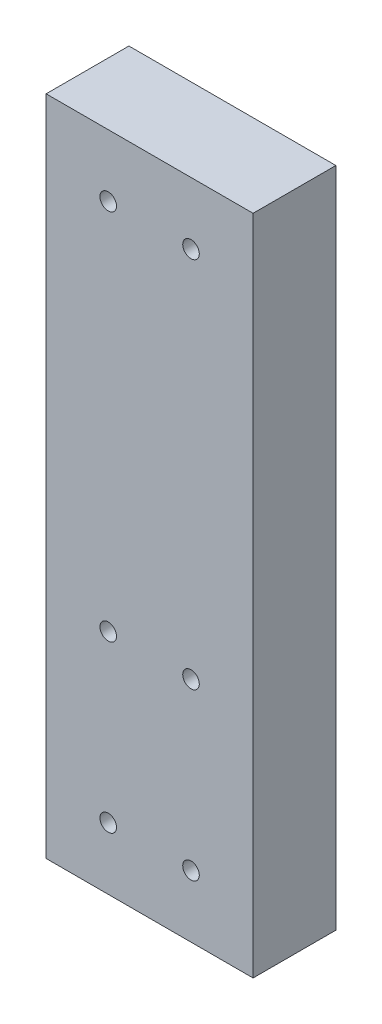
ISO-10303-21;
HEADER;
FILE_DESCRIPTION(('STEP AP214'),'2;1');
FILE_NAME('part.step','',(''),(''),'','','');
FILE_SCHEMA(('AUTOMOTIVE_DESIGN { 1 0 10303 214 1 1 1 1 }'));
ENDSEC;
DATA;
#1=APPLICATION_CONTEXT('core data for automotive mechanical design processes');
#2=APPLICATION_PROTOCOL_DEFINITION('international standard','automotive_design',2000,#1);
#3=PRODUCT_CONTEXT('',#1,'mechanical');
#4=PRODUCT('Part','Part','',(#3));
#5=PRODUCT_RELATED_PRODUCT_CATEGORY('part','',(#4));
#6=PRODUCT_DEFINITION_FORMATION('','',#4);
#7=PRODUCT_DEFINITION_CONTEXT('part definition',#1,'design');
#8=PRODUCT_DEFINITION('design','',#6,#7);
#9=PRODUCT_DEFINITION_SHAPE('','',#8);
#10=(LENGTH_UNIT() NAMED_UNIT(*) SI_UNIT(.MILLI.,.METRE.));
#11=(NAMED_UNIT(*) PLANE_ANGLE_UNIT() SI_UNIT($,.RADIAN.));
#12=(NAMED_UNIT(*) SI_UNIT($,.STERADIAN.) SOLID_ANGLE_UNIT());
#13=UNCERTAINTY_MEASURE_WITH_UNIT(LENGTH_MEASURE(1.E-05),#10,'distance_accuracy_value','');
#14=(GEOMETRIC_REPRESENTATION_CONTEXT(3) GLOBAL_UNCERTAINTY_ASSIGNED_CONTEXT((#13)) GLOBAL_UNIT_ASSIGNED_CONTEXT((#10,
#11,#12)) REPRESENTATION_CONTEXT('',''));
#15=CARTESIAN_POINT('',(0.,0.,0.));
#16=DIRECTION('',(0.,0.,1.));
#17=DIRECTION('',(1.,0.,0.));
#18=AXIS2_PLACEMENT_3D('',#15,#16,#17);
#19=CARTESIAN_POINT('',(0.,0.,10.));
#20=DIRECTION('',(0.,0.,1.));
#21=DIRECTION('',(1.,0.,0.));
#22=AXIS2_PLACEMENT_3D('',#19,#20,#21);
#23=PLANE('',#22);
#24=CARTESIAN_POINT('',(7.50000000000001,-72.5,10.));
#25=DIRECTION('',(0.,0.,1.));
#26=DIRECTION('',(1.,0.,0.));
#27=AXIS2_PLACEMENT_3D('',#24,#25,#26);
#28=CIRCLE('',#27,1.);
#29=CARTESIAN_POINT('',(8.50000000000001,-72.5,10.));
#30=VERTEX_POINT('',#29);
#31=EDGE_CURVE('E120',#30,#30,#28,.T.);
#32=ORIENTED_EDGE('',*,*,#31,.F.);
#33=EDGE_LOOP('',(#32));
#34=FACE_BOUND('',#33,.T.);
#35=CARTESIAN_POINT('',(7.5,-7.5,10.));
#36=DIRECTION('',(0.,0.,1.));
#37=DIRECTION('',(1.,0.,0.));
#38=AXIS2_PLACEMENT_3D('',#35,#36,#37);
#39=CIRCLE('',#38,1.);
#40=CARTESIAN_POINT('',(8.5,-7.5,10.));
#41=VERTEX_POINT('',#40);
#42=EDGE_CURVE('E139',#41,#41,#39,.T.);
#43=ORIENTED_EDGE('',*,*,#42,.F.);
#44=EDGE_LOOP('',(#43));
#45=FACE_BOUND('',#44,.T.);
#46=CARTESIAN_POINT('',(17.5,-52.5,10.));
#47=DIRECTION('',(0.,0.,-1.));
#48=DIRECTION('',(-1.,0.,0.));
#49=AXIS2_PLACEMENT_3D('',#46,#47,#48);
#50=CIRCLE('',#49,1.);
#51=CARTESIAN_POINT('',(16.5,-52.5,10.));
#52=VERTEX_POINT('',#51);
#53=EDGE_CURVE('E126',#52,#52,#50,.T.);
#54=ORIENTED_EDGE('',*,*,#53,.T.);
#55=EDGE_LOOP('',(#54));
#56=FACE_BOUND('',#55,.T.);
#57=DIRECTION('',(0.,-1.,0.));
#58=VECTOR('',#57,1.);
#59=CARTESIAN_POINT('',(0.,0.,10.));
#60=LINE('',#59,#58);
#61=CARTESIAN_POINT('',(0.,0.,10.));
#62=VERTEX_POINT('',#61);
#63=CARTESIAN_POINT('',(0.,-80.,10.));
#64=VERTEX_POINT('',#63);
#65=EDGE_CURVE('E90',#62,#64,#60,.T.);
#66=ORIENTED_EDGE('',*,*,#65,.T.);
#67=DIRECTION('',(1.,0.,0.));
#68=VECTOR('',#67,1.);
#69=CARTESIAN_POINT('',(0.,-80.,10.));
#70=LINE('',#69,#68);
#71=CARTESIAN_POINT('',(25.,-80.,10.));
#72=VERTEX_POINT('',#71);
#73=EDGE_CURVE('E85',#64,#72,#70,.T.);
#74=ORIENTED_EDGE('',*,*,#73,.T.);
#75=DIRECTION('',(0.,1.,0.));
#76=VECTOR('',#75,1.);
#77=CARTESIAN_POINT('',(25.,0.,10.));
#78=LINE('',#77,#76);
#79=CARTESIAN_POINT('',(25.,0.,10.));
#80=VERTEX_POINT('',#79);
#81=EDGE_CURVE('E88',#72,#80,#78,.T.);
#82=ORIENTED_EDGE('',*,*,#81,.T.);
#83=DIRECTION('',(-1.,0.,0.));
#84=VECTOR('',#83,1.);
#85=CARTESIAN_POINT('',(0.,0.,10.));
#86=LINE('',#85,#84);
#87=EDGE_CURVE('E55',#80,#62,#86,.T.);
#88=ORIENTED_EDGE('',*,*,#87,.T.);
#89=EDGE_LOOP('',(#66,#74,#82,#88));
#90=FACE_BOUND('',#89,.T.);
#91=CARTESIAN_POINT('',(7.50000000000001,-52.5,10.));
#92=DIRECTION('',(0.,0.,1.));
#93=DIRECTION('',(1.,0.,0.));
#94=AXIS2_PLACEMENT_3D('',#91,#92,#93);
#95=CIRCLE('',#94,1.);
#96=CARTESIAN_POINT('',(8.50000000000001,-52.5,10.));
#97=VERTEX_POINT('',#96);
#98=EDGE_CURVE('E117',#97,#97,#95,.T.);
#99=ORIENTED_EDGE('',*,*,#98,.F.);
#100=EDGE_LOOP('',(#99));
#101=FACE_BOUND('',#100,.T.);
#102=CARTESIAN_POINT('',(17.5,-72.5,10.));
#103=DIRECTION('',(0.,0.,-1.));
#104=DIRECTION('',(-1.,0.,0.));
#105=AXIS2_PLACEMENT_3D('',#102,#103,#104);
#106=CIRCLE('',#105,1.);
#107=CARTESIAN_POINT('',(16.5,-72.5,10.));
#108=VERTEX_POINT('',#107);
#109=EDGE_CURVE('E127',#108,#108,#106,.T.);
#110=ORIENTED_EDGE('',*,*,#109,.T.);
#111=EDGE_LOOP('',(#110));
#112=FACE_BOUND('',#111,.T.);
#113=CARTESIAN_POINT('',(17.5,-7.5,10.));
#114=DIRECTION('',(0.,0.,-1.));
#115=DIRECTION('',(-1.,0.,0.));
#116=AXIS2_PLACEMENT_3D('',#113,#114,#115);
#117=CIRCLE('',#116,0.999999999999998);
#118=CARTESIAN_POINT('',(16.5,-7.5,10.));
#119=VERTEX_POINT('',#118);
#120=EDGE_CURVE('E133',#119,#119,#117,.T.);
#121=ORIENTED_EDGE('',*,*,#120,.T.);
#122=EDGE_LOOP('',(#121));
#123=FACE_BOUND('',#122,.T.);
#124=ADVANCED_FACE('F38',(#34,#45,#56,#90,#101,#112,#123),#23,.T.);
#125=CARTESIAN_POINT('',(0.,0.,0.));
#126=DIRECTION('',(0.,0.,1.));
#127=DIRECTION('',(1.,0.,0.));
#128=AXIS2_PLACEMENT_3D('',#125,#126,#127);
#129=PLANE('',#128);
#130=CARTESIAN_POINT('',(7.50000000000001,-72.5,0.));
#131=DIRECTION('',(0.,0.,1.));
#132=DIRECTION('',(1.,0.,0.));
#133=AXIS2_PLACEMENT_3D('',#130,#131,#132);
#134=CIRCLE('',#133,1.);
#135=CARTESIAN_POINT('',(8.50000000000001,-72.5,0.));
#136=VERTEX_POINT('',#135);
#137=EDGE_CURVE('E142',#136,#136,#134,.T.);
#138=ORIENTED_EDGE('',*,*,#137,.T.);
#139=EDGE_LOOP('',(#138));
#140=FACE_BOUND('',#139,.T.);
#141=CARTESIAN_POINT('',(7.5,-7.5,0.));
#142=DIRECTION('',(0.,0.,1.));
#143=DIRECTION('',(1.,0.,0.));
#144=AXIS2_PLACEMENT_3D('',#141,#142,#143);
#145=CIRCLE('',#144,1.);
#146=CARTESIAN_POINT('',(8.5,-7.5,0.));
#147=VERTEX_POINT('',#146);
#148=EDGE_CURVE('E136',#147,#147,#145,.T.);
#149=ORIENTED_EDGE('',*,*,#148,.T.);
#150=EDGE_LOOP('',(#149));
#151=FACE_BOUND('',#150,.T.);
#152=CARTESIAN_POINT('',(7.50000000000001,-52.5,0.));
#153=DIRECTION('',(0.,0.,1.));
#154=DIRECTION('',(1.,0.,0.));
#155=AXIS2_PLACEMENT_3D('',#152,#153,#154);
#156=CIRCLE('',#155,1.);
#157=CARTESIAN_POINT('',(8.50000000000001,-52.5,0.));
#158=VERTEX_POINT('',#157);
#159=EDGE_CURVE('E105',#158,#158,#156,.T.);
#160=ORIENTED_EDGE('',*,*,#159,.T.);
#161=EDGE_LOOP('',(#160));
#162=FACE_BOUND('',#161,.T.);
#163=DIRECTION('',(0.,-1.,0.));
#164=VECTOR('',#163,1.);
#165=CARTESIAN_POINT('',(0.,0.,0.));
#166=LINE('',#165,#164);
#167=CARTESIAN_POINT('',(0.,0.,0.));
#168=VERTEX_POINT('',#167);
#169=CARTESIAN_POINT('',(0.,-80.,0.));
#170=VERTEX_POINT('',#169);
#171=EDGE_CURVE('E102',#168,#170,#166,.T.);
#172=ORIENTED_EDGE('',*,*,#171,.F.);
#173=DIRECTION('',(-1.,0.,0.));
#174=VECTOR('',#173,1.);
#175=CARTESIAN_POINT('',(0.,0.,0.));
#176=LINE('',#175,#174);
#177=CARTESIAN_POINT('',(25.,0.,0.));
#178=VERTEX_POINT('',#177);
#179=EDGE_CURVE('E78',#178,#168,#176,.T.);
#180=ORIENTED_EDGE('',*,*,#179,.F.);
#181=DIRECTION('',(0.,1.,0.));
#182=VECTOR('',#181,1.);
#183=CARTESIAN_POINT('',(25.,0.,0.));
#184=LINE('',#183,#182);
#185=CARTESIAN_POINT('',(25.,-80.,0.));
#186=VERTEX_POINT('',#185);
#187=EDGE_CURVE('E72',#186,#178,#184,.T.);
#188=ORIENTED_EDGE('',*,*,#187,.F.);
#189=DIRECTION('',(1.,0.,0.));
#190=VECTOR('',#189,1.);
#191=CARTESIAN_POINT('',(0.,-80.,0.));
#192=LINE('',#191,#190);
#193=EDGE_CURVE('E94',#170,#186,#192,.T.);
#194=ORIENTED_EDGE('',*,*,#193,.F.);
#195=EDGE_LOOP('',(#172,#180,#188,#194));
#196=FACE_BOUND('',#195,.T.);
#197=CARTESIAN_POINT('',(17.5,-72.5,0.));
#198=DIRECTION('',(0.,0.,-1.));
#199=DIRECTION('',(-1.,0.,0.));
#200=AXIS2_PLACEMENT_3D('',#197,#198,#199);
#201=CIRCLE('',#200,1.);
#202=CARTESIAN_POINT('',(16.5,-72.5,0.));
#203=VERTEX_POINT('',#202);
#204=EDGE_CURVE('E147',#203,#203,#201,.T.);
#205=ORIENTED_EDGE('',*,*,#204,.F.);
#206=EDGE_LOOP('',(#205));
#207=FACE_BOUND('',#206,.T.);
#208=CARTESIAN_POINT('',(17.5,-52.5,0.));
#209=DIRECTION('',(0.,0.,-1.));
#210=DIRECTION('',(-1.,0.,0.));
#211=AXIS2_PLACEMENT_3D('',#208,#209,#210);
#212=CIRCLE('',#211,1.);
#213=CARTESIAN_POINT('',(16.5,-52.5,0.));
#214=VERTEX_POINT('',#213);
#215=EDGE_CURVE('E123',#214,#214,#212,.T.);
#216=ORIENTED_EDGE('',*,*,#215,.F.);
#217=EDGE_LOOP('',(#216));
#218=FACE_BOUND('',#217,.T.);
#219=CARTESIAN_POINT('',(17.5,-7.5,0.));
#220=DIRECTION('',(0.,0.,-1.));
#221=DIRECTION('',(-1.,0.,0.));
#222=AXIS2_PLACEMENT_3D('',#219,#220,#221);
#223=CIRCLE('',#222,0.999999999999998);
#224=CARTESIAN_POINT('',(16.5,-7.5,0.));
#225=VERTEX_POINT('',#224);
#226=EDGE_CURVE('E130',#225,#225,#223,.T.);
#227=ORIENTED_EDGE('',*,*,#226,.F.);
#228=EDGE_LOOP('',(#227));
#229=FACE_BOUND('',#228,.T.);
#230=ADVANCED_FACE('F113',(#140,#151,#162,#196,#207,#218,#229),#129,.F.);
#231=CARTESIAN_POINT('',(0.,0.,10.));
#232=DIRECTION('',(1.,0.,0.));
#233=DIRECTION('',(0.,1.,0.));
#234=AXIS2_PLACEMENT_3D('',#231,#232,#233);
#235=PLANE('',#234);
#236=ORIENTED_EDGE('',*,*,#171,.T.);
#237=DIRECTION('',(0.,0.,-1.));
#238=VECTOR('',#237,1.);
#239=CARTESIAN_POINT('',(0.,-80.,10.));
#240=LINE('',#239,#238);
#241=EDGE_CURVE('E11',#64,#170,#240,.T.);
#242=ORIENTED_EDGE('',*,*,#241,.F.);
#243=ORIENTED_EDGE('',*,*,#65,.F.);
#244=DIRECTION('',(0.,0.,-1.));
#245=VECTOR('',#244,1.);
#246=CARTESIAN_POINT('',(0.,0.,10.));
#247=LINE('',#246,#245);
#248=EDGE_CURVE('E98',#62,#168,#247,.T.);
#249=ORIENTED_EDGE('',*,*,#248,.T.);
#250=EDGE_LOOP('',(#236,#242,#243,#249));
#251=FACE_BOUND('',#250,.T.);
#252=ADVANCED_FACE('F40',(#251),#235,.F.);
#253=CARTESIAN_POINT('',(0.,-80.,10.));
#254=DIRECTION('',(0.,1.,0.));
#255=DIRECTION('',(0.,0.,1.));
#256=AXIS2_PLACEMENT_3D('',#253,#254,#255);
#257=PLANE('',#256);
#258=ORIENTED_EDGE('',*,*,#193,.T.);
#259=DIRECTION('',(0.,0.,-1.));
#260=VECTOR('',#259,1.);
#261=CARTESIAN_POINT('',(25.,-80.,10.));
#262=LINE('',#261,#260);
#263=EDGE_CURVE('E47',#72,#186,#262,.T.);
#264=ORIENTED_EDGE('',*,*,#263,.F.);
#265=ORIENTED_EDGE('',*,*,#73,.F.);
#266=ORIENTED_EDGE('',*,*,#241,.T.);
#267=EDGE_LOOP('',(#258,#264,#265,#266));
#268=FACE_BOUND('',#267,.T.);
#269=ADVANCED_FACE('F93',(#268),#257,.F.);
#270=CARTESIAN_POINT('',(25.,0.,10.));
#271=DIRECTION('',(-1.,0.,0.));
#272=DIRECTION('',(0.,-1.,0.));
#273=AXIS2_PLACEMENT_3D('',#270,#271,#272);
#274=PLANE('',#273);
#275=ORIENTED_EDGE('',*,*,#187,.T.);
#276=DIRECTION('',(0.,0.,-1.));
#277=VECTOR('',#276,1.);
#278=CARTESIAN_POINT('',(25.,0.,10.));
#279=LINE('',#278,#277);
#280=EDGE_CURVE('E95',#80,#178,#279,.T.);
#281=ORIENTED_EDGE('',*,*,#280,.F.);
#282=ORIENTED_EDGE('',*,*,#81,.F.);
#283=ORIENTED_EDGE('',*,*,#263,.T.);
#284=EDGE_LOOP('',(#275,#281,#282,#283));
#285=FACE_BOUND('',#284,.T.);
#286=ADVANCED_FACE('F96',(#285),#274,.F.);
#287=CARTESIAN_POINT('',(0.,0.,10.));
#288=DIRECTION('',(0.,-1.,0.));
#289=DIRECTION('',(0.,0.,-1.));
#290=AXIS2_PLACEMENT_3D('',#287,#288,#289);
#291=PLANE('',#290);
#292=ORIENTED_EDGE('',*,*,#179,.T.);
#293=ORIENTED_EDGE('',*,*,#248,.F.);
#294=ORIENTED_EDGE('',*,*,#87,.F.);
#295=ORIENTED_EDGE('',*,*,#280,.T.);
#296=EDGE_LOOP('',(#292,#293,#294,#295));
#297=FACE_BOUND('',#296,.T.);
#298=ADVANCED_FACE('F110',(#297),#291,.F.);
#299=CARTESIAN_POINT('',(7.50000000000001,-52.5,0.));
#300=DIRECTION('',(0.,0.,1.));
#301=DIRECTION('',(1.,0.,0.));
#302=AXIS2_PLACEMENT_3D('',#299,#300,#301);
#303=CYLINDRICAL_SURFACE('',#302,1.);
#304=ORIENTED_EDGE('',*,*,#159,.F.);
#305=EDGE_LOOP('',(#304));
#306=FACE_BOUND('',#305,.T.);
#307=ORIENTED_EDGE('',*,*,#98,.T.);
#308=EDGE_LOOP('',(#307));
#309=FACE_BOUND('',#308,.T.);
#310=ADVANCED_FACE('F158',(#306,#309),#303,.F.);
#311=CARTESIAN_POINT('',(17.5,-72.5,0.));
#312=DIRECTION('',(0.,0.,1.));
#313=DIRECTION('',(1.,0.,0.));
#314=AXIS2_PLACEMENT_3D('',#311,#312,#313);
#315=CYLINDRICAL_SURFACE('',#314,1.);
#316=ORIENTED_EDGE('',*,*,#204,.T.);
#317=EDGE_LOOP('',(#316));
#318=FACE_BOUND('',#317,.T.);
#319=ORIENTED_EDGE('',*,*,#109,.F.);
#320=EDGE_LOOP('',(#319));
#321=FACE_BOUND('',#320,.T.);
#322=ADVANCED_FACE('F155',(#318,#321),#315,.F.);
#323=CARTESIAN_POINT('',(17.5,-52.5,0.));
#324=DIRECTION('',(0.,0.,1.));
#325=DIRECTION('',(1.,0.,0.));
#326=AXIS2_PLACEMENT_3D('',#323,#324,#325);
#327=CYLINDRICAL_SURFACE('',#326,1.);
#328=ORIENTED_EDGE('',*,*,#215,.T.);
#329=EDGE_LOOP('',(#328));
#330=FACE_BOUND('',#329,.T.);
#331=ORIENTED_EDGE('',*,*,#53,.F.);
#332=EDGE_LOOP('',(#331));
#333=FACE_BOUND('',#332,.T.);
#334=ADVANCED_FACE('F157',(#330,#333),#327,.F.);
#335=CARTESIAN_POINT('',(17.5,-7.5,0.));
#336=DIRECTION('',(0.,0.,1.));
#337=DIRECTION('',(1.,0.,0.));
#338=AXIS2_PLACEMENT_3D('',#335,#336,#337);
#339=CYLINDRICAL_SURFACE('',#338,0.999999999999998);
#340=ORIENTED_EDGE('',*,*,#226,.T.);
#341=EDGE_LOOP('',(#340));
#342=FACE_BOUND('',#341,.T.);
#343=ORIENTED_EDGE('',*,*,#120,.F.);
#344=EDGE_LOOP('',(#343));
#345=FACE_BOUND('',#344,.T.);
#346=ADVANCED_FACE('F165',(#342,#345),#339,.F.);
#347=CARTESIAN_POINT('',(7.5,-7.5,0.));
#348=DIRECTION('',(0.,0.,1.));
#349=DIRECTION('',(1.,0.,0.));
#350=AXIS2_PLACEMENT_3D('',#347,#348,#349);
#351=CYLINDRICAL_SURFACE('',#350,1.);
#352=ORIENTED_EDGE('',*,*,#148,.F.);
#353=EDGE_LOOP('',(#352));
#354=FACE_BOUND('',#353,.T.);
#355=ORIENTED_EDGE('',*,*,#42,.T.);
#356=EDGE_LOOP('',(#355));
#357=FACE_BOUND('',#356,.T.);
#358=ADVANCED_FACE('F224',(#354,#357),#351,.F.);
#359=CARTESIAN_POINT('',(7.50000000000001,-72.5,0.));
#360=DIRECTION('',(0.,0.,1.));
#361=DIRECTION('',(1.,0.,0.));
#362=AXIS2_PLACEMENT_3D('',#359,#360,#361);
#363=CYLINDRICAL_SURFACE('',#362,1.);
#364=ORIENTED_EDGE('',*,*,#137,.F.);
#365=EDGE_LOOP('',(#364));
#366=FACE_BOUND('',#365,.T.);
#367=ORIENTED_EDGE('',*,*,#31,.T.);
#368=EDGE_LOOP('',(#367));
#369=FACE_BOUND('',#368,.T.);
#370=ADVANCED_FACE('F234',(#366,#369),#363,.F.);
#371=CLOSED_SHELL('',(#124,#230,#252,#269,#286,#298,#310,#322,#334,#346,#358,#370));
#372=MANIFOLD_SOLID_BREP('B2',#371);
#373=ADVANCED_BREP_SHAPE_REPRESENTATION('',(#18,#372),#14);
#374=SHAPE_DEFINITION_REPRESENTATION(#9,#373);
ENDSEC;
END-ISO-10303-21;
